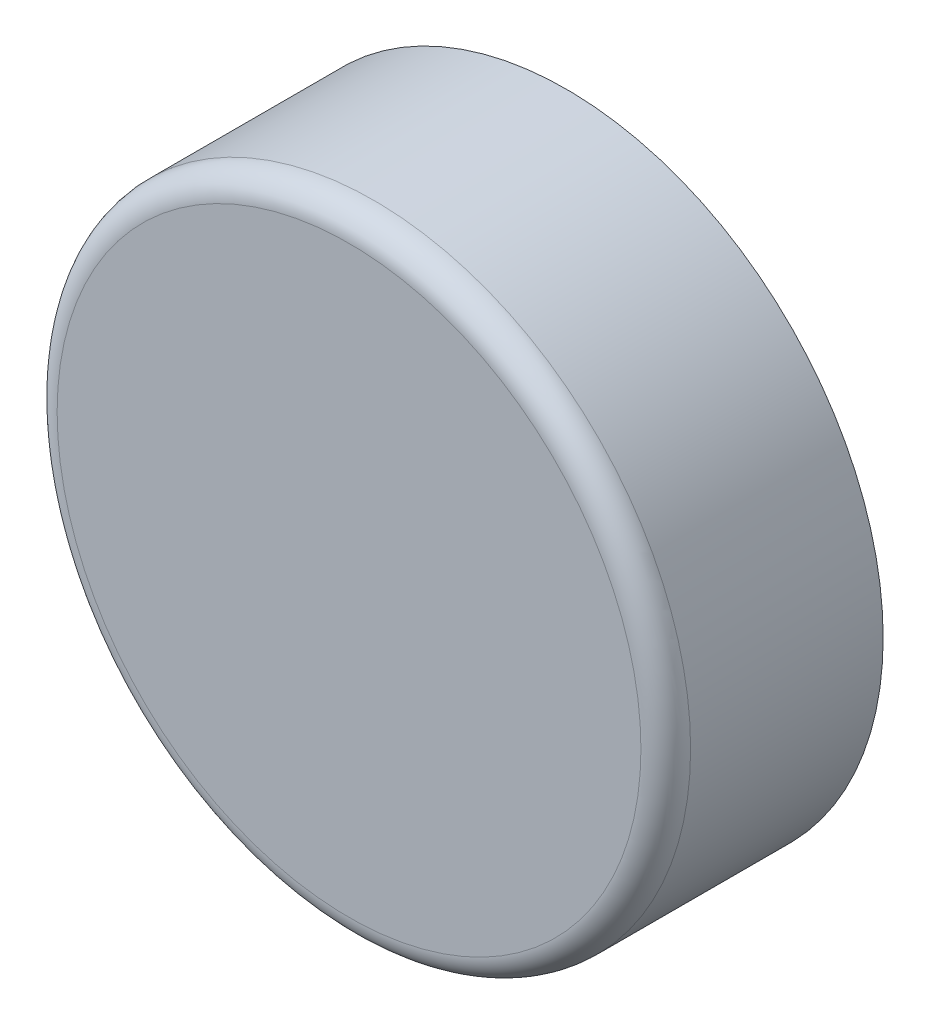
ISO-10303-21;
HEADER;
FILE_DESCRIPTION(('STEP AP214'),'2;1');
FILE_NAME('part.step','',(''),(''),'','','');
FILE_SCHEMA(('AUTOMOTIVE_DESIGN { 1 0 10303 214 1 1 1 1 }'));
ENDSEC;
DATA;
#1=APPLICATION_CONTEXT('core data for automotive mechanical design processes');
#2=APPLICATION_PROTOCOL_DEFINITION('international standard','automotive_design',2000,#1);
#3=PRODUCT_CONTEXT('',#1,'mechanical');
#4=PRODUCT('Part','Part','',(#3));
#5=PRODUCT_RELATED_PRODUCT_CATEGORY('part','',(#4));
#6=PRODUCT_DEFINITION_FORMATION('','',#4);
#7=PRODUCT_DEFINITION_CONTEXT('part definition',#1,'design');
#8=PRODUCT_DEFINITION('design','',#6,#7);
#9=PRODUCT_DEFINITION_SHAPE('','',#8);
#10=(LENGTH_UNIT() NAMED_UNIT(*) SI_UNIT(.MILLI.,.METRE.));
#11=(NAMED_UNIT(*) PLANE_ANGLE_UNIT() SI_UNIT($,.RADIAN.));
#12=(NAMED_UNIT(*) SI_UNIT($,.STERADIAN.) SOLID_ANGLE_UNIT());
#13=UNCERTAINTY_MEASURE_WITH_UNIT(LENGTH_MEASURE(1.E-05),#10,'distance_accuracy_value','');
#14=(GEOMETRIC_REPRESENTATION_CONTEXT(3) GLOBAL_UNCERTAINTY_ASSIGNED_CONTEXT((#13)) GLOBAL_UNIT_ASSIGNED_CONTEXT((#10,
#11,#12)) REPRESENTATION_CONTEXT('',''));
#15=CARTESIAN_POINT('',(0.,0.,0.));
#16=DIRECTION('',(0.,0.,1.));
#17=DIRECTION('',(1.,0.,0.));
#18=AXIS2_PLACEMENT_3D('',#15,#16,#17);
#19=CARTESIAN_POINT('',(3.81575680566778,1.5,0.));
#20=DIRECTION('',(0.,-1.,0.));
#21=DIRECTION('',(0.,0.,-1.));
#22=AXIS2_PLACEMENT_3D('',#19,#20,#21);
#23=PLANE('',#22);
#24=DIRECTION('',(0.,0.,1.));
#25=VECTOR('',#24,1.);
#26=CARTESIAN_POINT('',(3.81575680566778,1.5,0.));
#27=LINE('',#26,#25);
#28=CARTESIAN_POINT('',(3.81575680566778,1.5,1.9));
#29=VERTEX_POINT('',#28);
#30=CARTESIAN_POINT('',(3.81575680566778,1.5,1.4));
#31=VERTEX_POINT('',#30);
#32=EDGE_CURVE('E85',#29,#31,#27,.F.);
#33=ORIENTED_EDGE('',*,*,#32,.T.);
#34=CARTESIAN_POINT('',(3.81575680566778,1.5,1.9));
#35=CARTESIAN_POINT('',(3.80139060869233,1.49999999999999,1.88598631548121));
#36=CARTESIAN_POINT('',(3.78815737730604,1.49999999999999,1.87078972942495));
#37=CARTESIAN_POINT('',(3.76434453659747,1.50000000000001,1.83840897042549));
#38=CARTESIAN_POINT('',(3.75376911630161,1.50000000000002,1.82122172146764));
#39=CARTESIAN_POINT('',(3.73568778804339,1.49999999999998,1.78524575746864));
#40=CARTESIAN_POINT('',(3.72818850944359,1.49999999999995,1.76645368802888));
#41=CARTESIAN_POINT('',(3.71661565768007,1.50000000000005,1.72786088971128));
#42=CARTESIAN_POINT('',(3.71253826929904,1.5000000000002,1.70806131035512));
#43=CARTESIAN_POINT('',(3.70807498160108,1.49999999999981,1.66886995559483));
#44=CARTESIAN_POINT('',(3.7075452830286,1.4999999999993,1.64949449157155));
#45=CARTESIAN_POINT('',(3.709818627806,1.5000000000007,1.61094042047803));
#46=CARTESIAN_POINT('',(3.71262152761534,1.5000000000026,1.59176180496508));
#47=CARTESIAN_POINT('',(3.72135236020603,1.50000000000255,1.55453077860338));
#48=CARTESIAN_POINT('',(3.72721822090951,1.50000000000068,1.5364636914732));
#49=CARTESIAN_POINT('',(3.74181321265699,1.49999999999932,1.50152202996468));
#50=CARTESIAN_POINT('',(3.75054286869507,1.49999999999984,1.48464767492922));
#51=CARTESIAN_POINT('',(3.76832647638768,1.50000000000012,1.45607261561006));
#52=CARTESIAN_POINT('',(3.7768784205141,1.50000000000003,1.444054876011));
#53=CARTESIAN_POINT('',(3.79533960848316,1.49999999999997,1.42115303170038));
#54=CARTESIAN_POINT('',(3.80524590403796,1.50000000000001,1.41026655255157));
#55=CARTESIAN_POINT('',(3.81575680566762,1.5000000000004,1.40000000000009));
#56=B_SPLINE_CURVE_WITH_KNOTS('',3,(#34,#35,#36,#37,#38,#39,#40,#41,#42,#43,#44,#45,#46,#47,#48,
#49,#50,#51,#52,#53,#54,#55),.UNSPECIFIED.,.F.,.F.,(4,2,2,2,2,2,2,2,2,2,4),(0.,
0.0601668071968025,0.120427857975731,0.180818102947825,0.241140926364373,0.299003047591148,
0.356862676690833,0.41359282421872,0.470333377395996,0.514480479315194,0.558532963854867),.UNSPECIFIED.);
#57=EDGE_CURVE('E20',#29,#31,#56,.T.);
#58=ORIENTED_EDGE('',*,*,#57,.F.);
#59=EDGE_LOOP('',(#33,#58));
#60=FACE_BOUND('',#59,.T.);
#61=ADVANCED_FACE('F16',(#60),#23,.F.);
#62=CARTESIAN_POINT('',(-3.81575680566778,-1.5,0.));
#63=DIRECTION('',(0.,1.,0.));
#64=DIRECTION('',(0.,0.,1.));
#65=AXIS2_PLACEMENT_3D('',#62,#63,#64);
#66=PLANE('',#65);
#67=DIRECTION('',(0.,0.,1.));
#68=VECTOR('',#67,1.);
#69=CARTESIAN_POINT('',(3.81575680566778,-1.5,0.));
#70=LINE('',#69,#68);
#71=CARTESIAN_POINT('',(3.81575680566778,-1.5,1.4));
#72=VERTEX_POINT('',#71);
#73=CARTESIAN_POINT('',(3.81575680566778,-1.5,1.9));
#74=VERTEX_POINT('',#73);
#75=EDGE_CURVE('E101',#72,#74,#70,.T.);
#76=ORIENTED_EDGE('',*,*,#75,.T.);
#77=CARTESIAN_POINT('',(3.81575680566778,-1.5,1.4));
#78=CARTESIAN_POINT('',(3.80139060869233,-1.49999999999998,1.41401368451879));
#79=CARTESIAN_POINT('',(3.78815737730604,-1.49999999999999,1.42921027057505));
#80=CARTESIAN_POINT('',(3.76434453659747,-1.50000000000001,1.46159102957451));
#81=CARTESIAN_POINT('',(3.75376911630162,-1.50000000000002,1.47877827853236));
#82=CARTESIAN_POINT('',(3.73568778804339,-1.49999999999999,1.51475424253136));
#83=CARTESIAN_POINT('',(3.72818850944359,-1.49999999999995,1.53354631197112));
#84=CARTESIAN_POINT('',(3.71661565768007,-1.50000000000005,1.57213911028872));
#85=CARTESIAN_POINT('',(3.71253826929904,-1.5000000000002,1.59193868964488));
#86=CARTESIAN_POINT('',(3.70807498160108,-1.49999999999981,1.63113004440517));
#87=CARTESIAN_POINT('',(3.7075452830286,-1.4999999999993,1.65050550842845));
#88=CARTESIAN_POINT('',(3.709818627806,-1.5000000000007,1.68905957952197));
#89=CARTESIAN_POINT('',(3.71262152761534,-1.5000000000026,1.70823819503492));
#90=CARTESIAN_POINT('',(3.72135236020603,-1.50000000000255,1.74546922139662));
#91=CARTESIAN_POINT('',(3.72721822090951,-1.50000000000068,1.7635363085268));
#92=CARTESIAN_POINT('',(3.74181321265699,-1.49999999999932,1.79847797003532));
#93=CARTESIAN_POINT('',(3.75054286869507,-1.49999999999984,1.81535232507078));
#94=CARTESIAN_POINT('',(3.76832647638768,-1.50000000000012,1.84392738438994));
#95=CARTESIAN_POINT('',(3.7768784205141,-1.50000000000003,1.855945123989));
#96=CARTESIAN_POINT('',(3.79533960848316,-1.49999999999997,1.87884696829962));
#97=CARTESIAN_POINT('',(3.80524590403796,-1.50000000000001,1.88973344744843));
#98=CARTESIAN_POINT('',(3.81575680566762,-1.5000000000004,1.89999999999991));
#99=B_SPLINE_CURVE_WITH_KNOTS('',3,(#77,#78,#79,#80,#81,#82,#83,#84,#85,#86,#87,#88,#89,#90,#91,
#92,#93,#94,#95,#96,#97,#98),.UNSPECIFIED.,.F.,.F.,(4,2,2,2,2,2,2,2,2,2,4),(0.,
0.0601668071968026,0.120427857975731,0.180818102947826,0.241140926364374,0.299003047591149,
0.356862676690834,0.413592824218721,0.470333377395997,0.514480479315194,0.558532963854867),.UNSPECIFIED.);
#100=EDGE_CURVE('E98',#72,#74,#99,.T.);
#101=ORIENTED_EDGE('',*,*,#100,.F.);
#102=EDGE_LOOP('',(#76,#101));
#103=FACE_BOUND('',#102,.T.);
#104=ADVANCED_FACE('F203',(#103),#66,.F.);
#105=CARTESIAN_POINT('',(0.,0.,1.65));
#106=DIRECTION('',(0.,0.,1.));
#107=DIRECTION('',(1.,0.,0.));
#108=AXIS2_PLACEMENT_3D('',#105,#106,#107);
#109=TOROIDAL_SURFACE('',#108,4.3625,0.3625);
#110=ORIENTED_EDGE('',*,*,#100,.T.);
#111=CARTESIAN_POINT('',(0.,0.,1.9));
#112=DIRECTION('',(0.,0.,1.));
#113=DIRECTION('',(1.,0.,0.));
#114=AXIS2_PLACEMENT_3D('',#111,#112,#113);
#115=CIRCLE('',#114,4.1);
#116=EDGE_CURVE('E97',#74,#29,#115,.T.);
#117=ORIENTED_EDGE('',*,*,#116,.T.);
#118=ORIENTED_EDGE('',*,*,#57,.T.);
#119=CARTESIAN_POINT('',(0.,0.,1.4));
#120=DIRECTION('',(0.,0.,1.));
#121=DIRECTION('',(1.,0.,0.));
#122=AXIS2_PLACEMENT_3D('',#119,#120,#121);
#123=CIRCLE('',#122,4.1);
#124=EDGE_CURVE('E89',#31,#72,#123,.F.);
#125=ORIENTED_EDGE('',*,*,#124,.T.);
#126=EDGE_LOOP('',(#110,#117,#118,#125));
#127=FACE_BOUND('',#126,.T.);
#128=ADVANCED_FACE('F95',(#127),#109,.T.);
#129=CARTESIAN_POINT('',(-1.5,3.81575680566778,0.));
#130=DIRECTION('',(1.,0.,0.));
#131=DIRECTION('',(0.,0.,-1.));
#132=AXIS2_PLACEMENT_3D('',#129,#130,#131);
#133=PLANE('',#132);
#134=DIRECTION('',(0.,0.,1.));
#135=VECTOR('',#134,1.);
#136=CARTESIAN_POINT('',(-1.5,3.81575680566778,0.));
#137=LINE('',#136,#135);
#138=CARTESIAN_POINT('',(-1.5,3.81575680566778,1.9));
#139=VERTEX_POINT('',#138);
#140=CARTESIAN_POINT('',(-1.5,3.81575680566778,1.4));
#141=VERTEX_POINT('',#140);
#142=EDGE_CURVE('E208',#139,#141,#137,.F.);
#143=ORIENTED_EDGE('',*,*,#142,.T.);
#144=CARTESIAN_POINT('',(-1.5,3.81575680566778,1.9));
#145=CARTESIAN_POINT('',(-1.5,3.80140590950621,1.88600206855514));
#146=CARTESIAN_POINT('',(-1.5,3.78818558423929,1.87082252652514));
#147=CARTESIAN_POINT('',(-1.5,3.76436708899873,1.83844514674891));
#148=CARTESIAN_POINT('',(-1.5,3.75377879039019,1.82124005724234));
#149=CARTESIAN_POINT('',(-1.5,3.73567606801396,1.78522335309765));
#150=CARTESIAN_POINT('',(-1.5,3.72816898230207,1.76640803080771));
#151=CARTESIAN_POINT('',(-1.5,3.71660531464491,1.72780696119148));
#152=CARTESIAN_POINT('',(-1.5,3.71253613298425,1.7080250409854));
#153=CARTESIAN_POINT('',(-1.5,3.70882008656033,1.67542367251561));
#154=CARTESIAN_POINT('',(-1.5,3.70809791727015,1.66271545099623));
#155=CARTESIAN_POINT('',(-1.5,3.70810125528882,1.63071279165039));
#156=CARTESIAN_POINT('',(-1.5,3.70976787159709,1.61140894986068));
#157=CARTESIAN_POINT('',(-1.5,3.71637495460081,1.57333782942839));
#158=CARTESIAN_POINT('',(-1.5,3.7213224561901,1.55457179435302));
#159=CARTESIAN_POINT('',(-1.5,3.73426840399278,1.51819302003309));
#160=CARTESIAN_POINT('',(-1.5,3.74225758355076,1.50057696639676));
#161=CARTESIAN_POINT('',(-1.5,3.76100280283692,1.46685950968805));
#162=CARTESIAN_POINT('',(-1.5,3.7717612168063,1.4507594226089));
#163=CARTESIAN_POINT('',(-1.5,3.78866208835838,1.42933439831725));
#164=CARTESIAN_POINT('',(-1.5,3.79382491326603,1.42321399914667));
#165=CARTESIAN_POINT('',(-1.5,3.80451854439181,1.41133680067426));
#166=CARTESIAN_POINT('',(-1.5,3.81004819648805,1.40557896261553));
#167=CARTESIAN_POINT('',(-1.5,3.81575680566778,1.4));
#168=B_SPLINE_CURVE_WITH_KNOTS('',3,(#144,#145,#146,#147,#148,#149,#150,#151,#152,#153,#154,
#155,#156,#157,#158,#159,#160,#161,#162,#163,#164,#165,#166,#167),.UNSPECIFIED.,.F.,.F.,(4,2,2,
2,2,2,2,2,2,2,2,4),(0.,0.0601028610818858,0.120427846516437,0.180895676633031,0.241140922347588,
0.279259857336992,0.337079893875516,0.3950243110962,0.452793591741876,0.510612567613467,
0.534620727968011,0.558556640457983),.UNSPECIFIED.);
#169=EDGE_CURVE('E188',#139,#141,#168,.T.);
#170=ORIENTED_EDGE('',*,*,#169,.F.);
#171=EDGE_LOOP('',(#143,#170));
#172=FACE_BOUND('',#171,.T.);
#173=ADVANCED_FACE('F196',(#172),#133,.F.);
#174=CARTESIAN_POINT('',(0.,0.,1.65));
#175=DIRECTION('',(0.,0.,1.));
#176=DIRECTION('',(1.,0.,0.));
#177=AXIS2_PLACEMENT_3D('',#174,#175,#176);
#178=TOROIDAL_SURFACE('',#177,4.3625,0.3625);
#179=ORIENTED_EDGE('',*,*,#169,.T.);
#180=CARTESIAN_POINT('',(0.,0.,1.4));
#181=DIRECTION('',(0.,0.,1.));
#182=DIRECTION('',(1.,0.,0.));
#183=AXIS2_PLACEMENT_3D('',#180,#181,#182);
#184=CIRCLE('',#183,4.1);
#185=CARTESIAN_POINT('',(1.5,3.81575680566778,1.4));
#186=VERTEX_POINT('',#185);
#187=EDGE_CURVE('E215',#141,#186,#184,.F.);
#188=ORIENTED_EDGE('',*,*,#187,.T.);
#189=CARTESIAN_POINT('',(1.5,3.81575680566778,1.4));
#190=CARTESIAN_POINT('',(1.5,3.80140590950621,1.41399793144486));
#191=CARTESIAN_POINT('',(1.5,3.78818558423929,1.42917747347486));
#192=CARTESIAN_POINT('',(1.5,3.76436708899873,1.46155485325109));
#193=CARTESIAN_POINT('',(1.5,3.75377879039019,1.47875994275766));
#194=CARTESIAN_POINT('',(1.5,3.73567606801396,1.51477664690235));
#195=CARTESIAN_POINT('',(1.5,3.72816898230207,1.53359196919229));
#196=CARTESIAN_POINT('',(1.5,3.71660531464491,1.57219303880852));
#197=CARTESIAN_POINT('',(1.5,3.71253613298425,1.59197495901459));
#198=CARTESIAN_POINT('',(1.5,3.70882008656033,1.62457632748439));
#199=CARTESIAN_POINT('',(1.5,3.70809791727015,1.63728454900377));
#200=CARTESIAN_POINT('',(1.5,3.70810125528882,1.66928720834961));
#201=CARTESIAN_POINT('',(1.5,3.70976787159709,1.68859105013932));
#202=CARTESIAN_POINT('',(1.5,3.71637495460081,1.72666217057161));
#203=CARTESIAN_POINT('',(1.5,3.7213224561901,1.74542820564698));
#204=CARTESIAN_POINT('',(1.5,3.73426840399278,1.78180697996691));
#205=CARTESIAN_POINT('',(1.5,3.74225758355076,1.79942303360324));
#206=CARTESIAN_POINT('',(1.5,3.76100280283692,1.83314049031195));
#207=CARTESIAN_POINT('',(1.5,3.7717612168063,1.8492405773911));
#208=CARTESIAN_POINT('',(1.5,3.78866208835838,1.87066560168275));
#209=CARTESIAN_POINT('',(1.5,3.79382491326603,1.87678600085333));
#210=CARTESIAN_POINT('',(1.5,3.80451854439181,1.88866319932574));
#211=CARTESIAN_POINT('',(1.5,3.81004819648805,1.89442103738447));
#212=CARTESIAN_POINT('',(1.5,3.81575680566778,1.9));
#213=B_SPLINE_CURVE_WITH_KNOTS('',3,(#189,#190,#191,#192,#193,#194,#195,#196,#197,#198,#199,
#200,#201,#202,#203,#204,#205,#206,#207,#208,#209,#210,#211,#212),.UNSPECIFIED.,.F.,.F.,(4,2,2,
2,2,2,2,2,2,2,2,4),(0.,0.0601028610818861,0.120427846516436,0.180895676633031,0.241140922347587,
0.279259857336993,0.337079893875517,0.3950243110962,0.452793591741876,0.510612567613467,
0.534620727968012,0.558556640457984),.UNSPECIFIED.);
#214=CARTESIAN_POINT('',(1.5,3.81575680566778,1.9));
#215=VERTEX_POINT('',#214);
#216=EDGE_CURVE('E183',#186,#215,#213,.T.);
#217=ORIENTED_EDGE('',*,*,#216,.T.);
#218=CARTESIAN_POINT('',(0.,0.,1.9));
#219=DIRECTION('',(0.,0.,1.));
#220=DIRECTION('',(1.,0.,0.));
#221=AXIS2_PLACEMENT_3D('',#218,#219,#220);
#222=CIRCLE('',#221,4.1);
#223=EDGE_CURVE('E209',#215,#139,#222,.T.);
#224=ORIENTED_EDGE('',*,*,#223,.T.);
#225=EDGE_LOOP('',(#179,#188,#217,#224));
#226=FACE_BOUND('',#225,.T.);
#227=ADVANCED_FACE('F178',(#226),#178,.T.);
#228=CARTESIAN_POINT('',(1.5,3.70809924354783,0.));
#229=DIRECTION('',(-1.,0.,0.));
#230=DIRECTION('',(0.,0.,1.));
#231=AXIS2_PLACEMENT_3D('',#228,#229,#230);
#232=PLANE('',#231);
#233=ORIENTED_EDGE('',*,*,#216,.F.);
#234=DIRECTION('',(0.,0.,1.));
#235=VECTOR('',#234,1.);
#236=CARTESIAN_POINT('',(1.5,3.81575680566778,0.));
#237=LINE('',#236,#235);
#238=EDGE_CURVE('E217',#186,#215,#237,.T.);
#239=ORIENTED_EDGE('',*,*,#238,.T.);
#240=EDGE_LOOP('',(#233,#239));
#241=FACE_BOUND('',#240,.T.);
#242=ADVANCED_FACE('F173',(#241),#232,.F.);
#243=CARTESIAN_POINT('',(1.5,-3.81575680566778,0.));
#244=DIRECTION('',(-1.,0.,0.));
#245=DIRECTION('',(0.,0.,1.));
#246=AXIS2_PLACEMENT_3D('',#243,#244,#245);
#247=PLANE('',#246);
#248=DIRECTION('',(0.,0.,1.));
#249=VECTOR('',#248,1.);
#250=CARTESIAN_POINT('',(1.5,-3.81575680566778,0.));
#251=LINE('',#250,#249);
#252=CARTESIAN_POINT('',(1.5,-3.81575680566778,1.9));
#253=VERTEX_POINT('',#252);
#254=CARTESIAN_POINT('',(1.5,-3.81575680566778,1.4));
#255=VERTEX_POINT('',#254);
#256=EDGE_CURVE('E221',#253,#255,#251,.F.);
#257=ORIENTED_EDGE('',*,*,#256,.T.);
#258=CARTESIAN_POINT('',(1.5,-3.81575680566778,1.9));
#259=CARTESIAN_POINT('',(1.5,-3.80140590950621,1.88600206855514));
#260=CARTESIAN_POINT('',(1.5,-3.78818558423929,1.87082252652514));
#261=CARTESIAN_POINT('',(1.5,-3.76436708899873,1.83844514674891));
#262=CARTESIAN_POINT('',(1.5,-3.75377879039019,1.82124005724234));
#263=CARTESIAN_POINT('',(1.5,-3.73567606801396,1.78522335309765));
#264=CARTESIAN_POINT('',(1.5,-3.72816898230207,1.76640803080771));
#265=CARTESIAN_POINT('',(1.5,-3.7166053146449,1.72780696119148));
#266=CARTESIAN_POINT('',(1.5,-3.71253613298425,1.70802504098541));
#267=CARTESIAN_POINT('',(1.5,-3.70882008656033,1.67542367251561));
#268=CARTESIAN_POINT('',(1.5,-3.70809791727015,1.66271545099623));
#269=CARTESIAN_POINT('',(1.5,-3.70810125528882,1.63071279165039));
#270=CARTESIAN_POINT('',(1.5,-3.70976787159709,1.61140894986068));
#271=CARTESIAN_POINT('',(1.5,-3.71637495460081,1.57333782942839));
#272=CARTESIAN_POINT('',(1.5,-3.7213224561901,1.55457179435302));
#273=CARTESIAN_POINT('',(1.5,-3.73426840399278,1.51819302003309));
#274=CARTESIAN_POINT('',(1.5,-3.74225758355076,1.50057696639676));
#275=CARTESIAN_POINT('',(1.5,-3.76100280283692,1.46685950968805));
#276=CARTESIAN_POINT('',(1.5,-3.7717612168063,1.4507594226089));
#277=CARTESIAN_POINT('',(1.5,-3.78866208835838,1.42933439831725));
#278=CARTESIAN_POINT('',(1.5,-3.79382491326603,1.42321399914667));
#279=CARTESIAN_POINT('',(1.5,-3.80451854439181,1.41133680067426));
#280=CARTESIAN_POINT('',(1.5,-3.81004819648805,1.40557896261553));
#281=CARTESIAN_POINT('',(1.5,-3.81575680566778,1.4));
#282=B_SPLINE_CURVE_WITH_KNOTS('',3,(#258,#259,#260,#261,#262,#263,#264,#265,#266,#267,#268,
#269,#270,#271,#272,#273,#274,#275,#276,#277,#278,#279,#280,#281),.UNSPECIFIED.,.F.,.F.,(4,2,2,
2,2,2,2,2,2,2,2,4),(0.,0.0601028610818859,0.120427846516437,0.180895676633031,0.241140922347588,
0.279259857336993,0.337079893875517,0.395024311096201,0.452793591741877,0.510612567613468,
0.534620727968013,0.558556640457985),.UNSPECIFIED.);
#283=EDGE_CURVE('E165',#253,#255,#282,.T.);
#284=ORIENTED_EDGE('',*,*,#283,.F.);
#285=EDGE_LOOP('',(#257,#284));
#286=FACE_BOUND('',#285,.T.);
#287=ADVANCED_FACE('F169',(#286),#247,.F.);
#288=CARTESIAN_POINT('',(-1.5,-3.70809924354783,0.));
#289=DIRECTION('',(1.,0.,0.));
#290=DIRECTION('',(0.,0.,-1.));
#291=AXIS2_PLACEMENT_3D('',#288,#289,#290);
#292=PLANE('',#291);
#293=CARTESIAN_POINT('',(-1.5,-3.81575680566778,1.4));
#294=CARTESIAN_POINT('',(-1.5,-3.80140590950621,1.41399793144486));
#295=CARTESIAN_POINT('',(-1.5,-3.78818558423929,1.42917747347486));
#296=CARTESIAN_POINT('',(-1.5,-3.76436708899873,1.46155485325109));
#297=CARTESIAN_POINT('',(-1.5,-3.75377879039019,1.47875994275766));
#298=CARTESIAN_POINT('',(-1.5,-3.73567606801396,1.51477664690235));
#299=CARTESIAN_POINT('',(-1.5,-3.72816898230207,1.53359196919229));
#300=CARTESIAN_POINT('',(-1.5,-3.71660531464491,1.57219303880852));
#301=CARTESIAN_POINT('',(-1.5,-3.71253613298425,1.59197495901459));
#302=CARTESIAN_POINT('',(-1.5,-3.70882008656033,1.62457632748439));
#303=CARTESIAN_POINT('',(-1.5,-3.70809791727015,1.63728454900377));
#304=CARTESIAN_POINT('',(-1.5,-3.70810125528882,1.66928720834961));
#305=CARTESIAN_POINT('',(-1.5,-3.70976787159709,1.68859105013932));
#306=CARTESIAN_POINT('',(-1.5,-3.71637495460081,1.72666217057161));
#307=CARTESIAN_POINT('',(-1.5,-3.7213224561901,1.74542820564698));
#308=CARTESIAN_POINT('',(-1.5,-3.73426840399278,1.78180697996691));
#309=CARTESIAN_POINT('',(-1.5,-3.74225758355076,1.79942303360324));
#310=CARTESIAN_POINT('',(-1.5,-3.76100280283692,1.83314049031195));
#311=CARTESIAN_POINT('',(-1.5,-3.7717612168063,1.8492405773911));
#312=CARTESIAN_POINT('',(-1.5,-3.78866208835838,1.87066560168275));
#313=CARTESIAN_POINT('',(-1.5,-3.79382491326603,1.87678600085333));
#314=CARTESIAN_POINT('',(-1.5,-3.80451854439181,1.88866319932574));
#315=CARTESIAN_POINT('',(-1.5,-3.81004819648805,1.89442103738447));
#316=CARTESIAN_POINT('',(-1.5,-3.81575680566778,1.9));
#317=B_SPLINE_CURVE_WITH_KNOTS('',3,(#293,#294,#295,#296,#297,#298,#299,#300,#301,#302,#303,
#304,#305,#306,#307,#308,#309,#310,#311,#312,#313,#314,#315,#316),.UNSPECIFIED.,.F.,.F.,(4,2,2,
2,2,2,2,2,2,2,2,4),(0.,0.0601028610818859,0.120427846516436,0.180895676633031,0.241140922347587,
0.279259857336993,0.337079893875517,0.3950243110962,0.452793591741876,0.510612567613467,
0.534620727968012,0.558556640457984),.UNSPECIFIED.);
#318=CARTESIAN_POINT('',(-1.5,-3.81575680566778,1.4));
#319=VERTEX_POINT('',#318);
#320=CARTESIAN_POINT('',(-1.5,-3.81575680566778,1.9));
#321=VERTEX_POINT('',#320);
#322=EDGE_CURVE('E160',#319,#321,#317,.T.);
#323=ORIENTED_EDGE('',*,*,#322,.F.);
#324=DIRECTION('',(0.,0.,1.));
#325=VECTOR('',#324,1.);
#326=CARTESIAN_POINT('',(-1.5,-3.81575680566778,0.));
#327=LINE('',#326,#325);
#328=EDGE_CURVE('E148',#319,#321,#327,.T.);
#329=ORIENTED_EDGE('',*,*,#328,.T.);
#330=EDGE_LOOP('',(#323,#329));
#331=FACE_BOUND('',#330,.T.);
#332=ADVANCED_FACE('F154',(#331),#292,.F.);
#333=CARTESIAN_POINT('',(0.,0.,1.65));
#334=DIRECTION('',(0.,0.,1.));
#335=DIRECTION('',(1.,0.,0.));
#336=AXIS2_PLACEMENT_3D('',#333,#334,#335);
#337=TOROIDAL_SURFACE('',#336,4.3625,0.3625);
#338=CARTESIAN_POINT('',(0.,0.,1.9));
#339=DIRECTION('',(0.,0.,1.));
#340=DIRECTION('',(1.,0.,0.));
#341=AXIS2_PLACEMENT_3D('',#338,#339,#340);
#342=CIRCLE('',#341,4.1);
#343=EDGE_CURVE('E228',#321,#253,#342,.T.);
#344=ORIENTED_EDGE('',*,*,#343,.T.);
#345=ORIENTED_EDGE('',*,*,#283,.T.);
#346=CARTESIAN_POINT('',(0.,0.,1.4));
#347=DIRECTION('',(0.,0.,1.));
#348=DIRECTION('',(1.,0.,0.));
#349=AXIS2_PLACEMENT_3D('',#346,#347,#348);
#350=CIRCLE('',#349,4.1);
#351=EDGE_CURVE('E224',#255,#319,#350,.F.);
#352=ORIENTED_EDGE('',*,*,#351,.T.);
#353=ORIENTED_EDGE('',*,*,#322,.T.);
#354=EDGE_LOOP('',(#344,#345,#352,#353));
#355=FACE_BOUND('',#354,.T.);
#356=ADVANCED_FACE('F150',(#355),#337,.T.);
#357=CARTESIAN_POINT('',(-3.81575680566778,-1.5,0.));
#358=DIRECTION('',(0.,1.,0.));
#359=DIRECTION('',(0.,0.,1.));
#360=AXIS2_PLACEMENT_3D('',#357,#358,#359);
#361=PLANE('',#360);
#362=DIRECTION('',(0.,0.,1.));
#363=VECTOR('',#362,1.);
#364=CARTESIAN_POINT('',(-3.81575680566778,-1.5,0.));
#365=LINE('',#364,#363);
#366=CARTESIAN_POINT('',(-3.81575680566778,-1.5,1.9));
#367=VERTEX_POINT('',#366);
#368=CARTESIAN_POINT('',(-3.81575680566778,-1.5,1.4));
#369=VERTEX_POINT('',#368);
#370=EDGE_CURVE('E144',#367,#369,#365,.F.);
#371=ORIENTED_EDGE('',*,*,#370,.T.);
#372=CARTESIAN_POINT('',(-3.81575680566778,-1.5,1.9));
#373=CARTESIAN_POINT('',(-3.80139060869233,-1.49999999999999,1.88598631548121));
#374=CARTESIAN_POINT('',(-3.78815737730604,-1.49999999999999,1.87078972942495));
#375=CARTESIAN_POINT('',(-3.76434453659747,-1.50000000000001,1.83840897042549));
#376=CARTESIAN_POINT('',(-3.75376911630162,-1.50000000000001,1.82122172146764));
#377=CARTESIAN_POINT('',(-3.73568778804339,-1.49999999999998,1.78524575746864));
#378=CARTESIAN_POINT('',(-3.72818850944359,-1.49999999999995,1.76645368802888));
#379=CARTESIAN_POINT('',(-3.71661565768007,-1.50000000000005,1.72786088971128));
#380=CARTESIAN_POINT('',(-3.71253826929904,-1.5000000000002,1.70806131035512));
#381=CARTESIAN_POINT('',(-3.70807498160108,-1.49999999999981,1.66886995559483));
#382=CARTESIAN_POINT('',(-3.7075452830286,-1.4999999999993,1.64949449157155));
#383=CARTESIAN_POINT('',(-3.709818627806,-1.5000000000007,1.61094042047803));
#384=CARTESIAN_POINT('',(-3.71262152761534,-1.5000000000026,1.59176180496508));
#385=CARTESIAN_POINT('',(-3.72135236020603,-1.50000000000255,1.55453077860338));
#386=CARTESIAN_POINT('',(-3.72721822090951,-1.50000000000068,1.5364636914732));
#387=CARTESIAN_POINT('',(-3.74181321265699,-1.49999999999932,1.50152202996468));
#388=CARTESIAN_POINT('',(-3.75054286869507,-1.49999999999984,1.48464767492922));
#389=CARTESIAN_POINT('',(-3.76832647638768,-1.50000000000012,1.45607261561006));
#390=CARTESIAN_POINT('',(-3.7768784205141,-1.50000000000003,1.444054876011));
#391=CARTESIAN_POINT('',(-3.79533960848316,-1.49999999999997,1.42115303170038));
#392=CARTESIAN_POINT('',(-3.80524590403796,-1.50000000000001,1.41026655255157));
#393=CARTESIAN_POINT('',(-3.81575680566762,-1.5000000000004,1.40000000000009));
#394=B_SPLINE_CURVE_WITH_KNOTS('',3,(#372,#373,#374,#375,#376,#377,#378,#379,#380,#381,#382,
#383,#384,#385,#386,#387,#388,#389,#390,#391,#392,#393),.UNSPECIFIED.,.F.,.F.,(4,2,2,2,2,2,2,2,
2,2,4),(0.,0.0601668071968029,0.120427857975732,0.180818102947827,0.241140926364375,
0.29900304759115,0.356862676690835,0.413592824218722,0.470333377395999,0.514480479315196,
0.558532963854868),.UNSPECIFIED.);
#395=EDGE_CURVE('E122',#367,#369,#394,.T.);
#396=ORIENTED_EDGE('',*,*,#395,.F.);
#397=EDGE_LOOP('',(#371,#396));
#398=FACE_BOUND('',#397,.T.);
#399=ADVANCED_FACE('F135',(#398),#361,.F.);
#400=CARTESIAN_POINT('',(0.,0.,1.65));
#401=DIRECTION('',(0.,0.,1.));
#402=DIRECTION('',(1.,0.,0.));
#403=AXIS2_PLACEMENT_3D('',#400,#401,#402);
#404=TOROIDAL_SURFACE('',#403,4.3625,0.3625);
#405=ORIENTED_EDGE('',*,*,#395,.T.);
#406=CARTESIAN_POINT('',(0.,0.,1.4));
#407=DIRECTION('',(0.,0.,1.));
#408=DIRECTION('',(1.,0.,0.));
#409=AXIS2_PLACEMENT_3D('',#406,#407,#408);
#410=CIRCLE('',#409,4.1);
#411=CARTESIAN_POINT('',(-3.81575680566778,1.5,1.4));
#412=VERTEX_POINT('',#411);
#413=EDGE_CURVE('E39',#369,#412,#410,.F.);
#414=ORIENTED_EDGE('',*,*,#413,.T.);
#415=CARTESIAN_POINT('',(-3.81575680566778,1.5,1.4));
#416=CARTESIAN_POINT('',(-3.80139060869233,1.49999999999998,1.41401368451879));
#417=CARTESIAN_POINT('',(-3.78815737730604,1.49999999999999,1.42921027057505));
#418=CARTESIAN_POINT('',(-3.76434453659747,1.50000000000001,1.46159102957451));
#419=CARTESIAN_POINT('',(-3.75376911630162,1.50000000000002,1.47877827853236));
#420=CARTESIAN_POINT('',(-3.73568778804339,1.49999999999999,1.51475424253136));
#421=CARTESIAN_POINT('',(-3.72818850944359,1.49999999999995,1.53354631197112));
#422=CARTESIAN_POINT('',(-3.71661565768007,1.50000000000005,1.57213911028872));
#423=CARTESIAN_POINT('',(-3.71253826929904,1.5000000000002,1.59193868964488));
#424=CARTESIAN_POINT('',(-3.70807498160108,1.49999999999981,1.63113004440517));
#425=CARTESIAN_POINT('',(-3.7075452830286,1.4999999999993,1.65050550842845));
#426=CARTESIAN_POINT('',(-3.709818627806,1.5000000000007,1.68905957952197));
#427=CARTESIAN_POINT('',(-3.71262152761534,1.5000000000026,1.70823819503492));
#428=CARTESIAN_POINT('',(-3.72135236020603,1.50000000000255,1.74546922139662));
#429=CARTESIAN_POINT('',(-3.72721822090951,1.50000000000068,1.7635363085268));
#430=CARTESIAN_POINT('',(-3.74181321265699,1.49999999999932,1.79847797003532));
#431=CARTESIAN_POINT('',(-3.75054286869507,1.49999999999984,1.81535232507078));
#432=CARTESIAN_POINT('',(-3.76832647638768,1.50000000000012,1.84392738438994));
#433=CARTESIAN_POINT('',(-3.7768784205141,1.50000000000003,1.855945123989));
#434=CARTESIAN_POINT('',(-3.79533960848316,1.49999999999997,1.87884696829962));
#435=CARTESIAN_POINT('',(-3.80524590403796,1.50000000000001,1.88973344744843));
#436=CARTESIAN_POINT('',(-3.81575680566762,1.5000000000004,1.89999999999992));
#437=B_SPLINE_CURVE_WITH_KNOTS('',3,(#415,#416,#417,#418,#419,#420,#421,#422,#423,#424,#425,
#426,#427,#428,#429,#430,#431,#432,#433,#434,#435,#436),.UNSPECIFIED.,.F.,.F.,(4,2,2,2,2,2,2,2,
2,2,4),(0.,0.0601668071968025,0.120427857975732,0.180818102947826,0.241140926364374,
0.299003047591149,0.356862676690835,0.413592824218722,0.470333377395998,0.514480479315195,
0.558532963854868),.UNSPECIFIED.);
#438=CARTESIAN_POINT('',(-3.8157568056677,1.5000000000002,1.89999999999996));
#439=VERTEX_POINT('',#438);
#440=EDGE_CURVE('E90',#412,#439,#437,.T.);
#441=ORIENTED_EDGE('',*,*,#440,.T.);
#442=CARTESIAN_POINT('',(0.,0.,1.9));
#443=DIRECTION('',(0.,0.,1.));
#444=DIRECTION('',(1.,0.,0.));
#445=AXIS2_PLACEMENT_3D('',#442,#443,#444);
#446=CIRCLE('',#445,4.1);
#447=EDGE_CURVE('E142',#439,#367,#446,.T.);
#448=ORIENTED_EDGE('',*,*,#447,.T.);
#449=EDGE_LOOP('',(#405,#414,#441,#448));
#450=FACE_BOUND('',#449,.T.);
#451=ADVANCED_FACE('F131',(#450),#404,.T.);
#452=CARTESIAN_POINT('',(3.81575680566778,1.5,0.));
#453=DIRECTION('',(0.,-1.,0.));
#454=DIRECTION('',(0.,0.,-1.));
#455=AXIS2_PLACEMENT_3D('',#452,#453,#454);
#456=PLANE('',#455);
#457=DIRECTION('',(0.,0.,1.));
#458=VECTOR('',#457,1.);
#459=CARTESIAN_POINT('',(-3.81575680566778,1.5,0.));
#460=LINE('',#459,#458);
#461=EDGE_CURVE('E115',#412,#439,#460,.T.);
#462=ORIENTED_EDGE('',*,*,#461,.T.);
#463=ORIENTED_EDGE('',*,*,#440,.F.);
#464=EDGE_LOOP('',(#462,#463));
#465=FACE_BOUND('',#464,.T.);
#466=ADVANCED_FACE('F128',(#465),#456,.F.);
#467=CARTESIAN_POINT('',(0.,0.,2.5));
#468=DIRECTION('',(0.,0.,-1.));
#469=DIRECTION('',(-1.,0.,0.));
#470=AXIS2_PLACEMENT_3D('',#467,#468,#469);
#471=PLANE('',#470);
#472=CARTESIAN_POINT('',(0.,0.,2.5));
#473=DIRECTION('',(0.,0.,1.));
#474=DIRECTION('',(1.,0.,0.));
#475=AXIS2_PLACEMENT_3D('',#472,#473,#474);
#476=CIRCLE('',#475,4.1);
#477=CARTESIAN_POINT('',(4.1,0.,2.5));
#478=VERTEX_POINT('',#477);
#479=EDGE_CURVE('E112',#478,#478,#476,.F.);
#480=ORIENTED_EDGE('',*,*,#479,.T.);
#481=EDGE_LOOP('',(#480));
#482=FACE_BOUND('',#481,.T.);
#483=ADVANCED_FACE('F241',(#482),#471,.T.);
#484=CARTESIAN_POINT('',(0.,0.,0.));
#485=DIRECTION('',(0.,0.,1.));
#486=DIRECTION('',(1.,0.,0.));
#487=AXIS2_PLACEMENT_3D('',#484,#485,#486);
#488=CYLINDRICAL_SURFACE('',#487,4.1);
#489=ORIENTED_EDGE('',*,*,#479,.F.);
#490=EDGE_LOOP('',(#489));
#491=FACE_BOUND('',#490,.T.);
#492=ORIENTED_EDGE('',*,*,#413,.F.);
#493=ORIENTED_EDGE('',*,*,#370,.F.);
#494=ORIENTED_EDGE('',*,*,#447,.F.);
#495=ORIENTED_EDGE('',*,*,#461,.F.);
#496=EDGE_LOOP('',(#492,#493,#494,#495));
#497=FACE_BOUND('',#496,.T.);
#498=ORIENTED_EDGE('',*,*,#328,.F.);
#499=ORIENTED_EDGE('',*,*,#351,.F.);
#500=ORIENTED_EDGE('',*,*,#256,.F.);
#501=ORIENTED_EDGE('',*,*,#343,.F.);
#502=EDGE_LOOP('',(#498,#499,#500,#501));
#503=FACE_BOUND('',#502,.T.);
#504=ORIENTED_EDGE('',*,*,#187,.F.);
#505=ORIENTED_EDGE('',*,*,#142,.F.);
#506=ORIENTED_EDGE('',*,*,#223,.F.);
#507=ORIENTED_EDGE('',*,*,#238,.F.);
#508=EDGE_LOOP('',(#504,#505,#506,#507));
#509=FACE_BOUND('',#508,.T.);
#510=ORIENTED_EDGE('',*,*,#75,.F.);
#511=ORIENTED_EDGE('',*,*,#124,.F.);
#512=ORIENTED_EDGE('',*,*,#32,.F.);
#513=ORIENTED_EDGE('',*,*,#116,.F.);
#514=EDGE_LOOP('',(#510,#511,#512,#513));
#515=FACE_BOUND('',#514,.T.);
#516=CARTESIAN_POINT('',(0.,0.,0.));
#517=DIRECTION('',(0.,0.,1.));
#518=DIRECTION('',(1.,0.,0.));
#519=AXIS2_PLACEMENT_3D('',#516,#517,#518);
#520=CIRCLE('',#519,4.1);
#521=CARTESIAN_POINT('',(4.1,0.,0.));
#522=VERTEX_POINT('',#521);
#523=EDGE_CURVE('E109',#522,#522,#520,.T.);
#524=ORIENTED_EDGE('',*,*,#523,.F.);
#525=EDGE_LOOP('',(#524));
#526=FACE_BOUND('',#525,.T.);
#527=ADVANCED_FACE('F99',(#491,#497,#503,#509,#515,#526),#488,.F.);
#528=CARTESIAN_POINT('',(0.,0.,3.5));
#529=DIRECTION('',(0.,0.,-1.));
#530=DIRECTION('',(-1.,0.,0.));
#531=AXIS2_PLACEMENT_3D('',#528,#529,#530);
#532=PLANE('',#531);
#533=CARTESIAN_POINT('',(0.,0.,3.5));
#534=DIRECTION('',(0.,0.,-1.));
#535=DIRECTION('',(1.,0.,0.));
#536=AXIS2_PLACEMENT_3D('',#533,#534,#535);
#537=CIRCLE('',#536,4.7);
#538=CARTESIAN_POINT('',(4.7,0.,3.5));
#539=VERTEX_POINT('',#538);
#540=EDGE_CURVE('E108',#539,#539,#537,.T.);
#541=ORIENTED_EDGE('',*,*,#540,.F.);
#542=EDGE_LOOP('',(#541));
#543=FACE_BOUND('',#542,.T.);
#544=ADVANCED_FACE('F240',(#543),#532,.F.);
#545=CARTESIAN_POINT('',(0.,0.,0.));
#546=DIRECTION('',(0.,0.,-1.));
#547=DIRECTION('',(-1.,0.,0.));
#548=AXIS2_PLACEMENT_3D('',#545,#546,#547);
#549=PLANE('',#548);
#550=ORIENTED_EDGE('',*,*,#523,.T.);
#551=EDGE_LOOP('',(#550));
#552=FACE_BOUND('',#551,.T.);
#553=CARTESIAN_POINT('',(0.,0.,0.));
#554=DIRECTION('',(0.,0.,1.));
#555=DIRECTION('',(1.,0.,0.));
#556=AXIS2_PLACEMENT_3D('',#553,#554,#555);
#557=CIRCLE('',#556,5.1);
#558=CARTESIAN_POINT('',(5.1,0.,0.));
#559=VERTEX_POINT('',#558);
#560=EDGE_CURVE('E30',#559,#559,#557,.T.);
#561=ORIENTED_EDGE('',*,*,#560,.F.);
#562=EDGE_LOOP('',(#561));
#563=FACE_BOUND('',#562,.T.);
#564=ADVANCED_FACE('F258',(#552,#563),#549,.T.);
#565=CARTESIAN_POINT('',(0.,0.,3.1));
#566=DIRECTION('',(0.,0.,-1.));
#567=DIRECTION('',(-1.,0.,0.));
#568=AXIS2_PLACEMENT_3D('',#565,#566,#567);
#569=TOROIDAL_SURFACE('',#568,4.7,0.4);
#570=CARTESIAN_POINT('',(0.,0.,3.1));
#571=DIRECTION('',(0.,0.,1.));
#572=DIRECTION('',(1.,0.,0.));
#573=AXIS2_PLACEMENT_3D('',#570,#571,#572);
#574=CIRCLE('',#573,5.1);
#575=CARTESIAN_POINT('',(5.1,0.,3.1));
#576=VERTEX_POINT('',#575);
#577=EDGE_CURVE('E10',#576,#576,#574,.F.);
#578=ORIENTED_EDGE('',*,*,#577,.F.);
#579=EDGE_LOOP('',(#578));
#580=FACE_BOUND('',#579,.T.);
#581=ORIENTED_EDGE('',*,*,#540,.T.);
#582=EDGE_LOOP('',(#581));
#583=FACE_BOUND('',#582,.T.);
#584=ADVANCED_FACE('F252',(#580,#583),#569,.T.);
#585=CARTESIAN_POINT('',(0.,0.,0.));
#586=DIRECTION('',(0.,0.,1.));
#587=DIRECTION('',(1.,0.,0.));
#588=AXIS2_PLACEMENT_3D('',#585,#586,#587);
#589=CYLINDRICAL_SURFACE('',#588,5.1);
#590=ORIENTED_EDGE('',*,*,#577,.T.);
#591=EDGE_LOOP('',(#590));
#592=FACE_BOUND('',#591,.T.);
#593=ORIENTED_EDGE('',*,*,#560,.T.);
#594=EDGE_LOOP('',(#593));
#595=FACE_BOUND('',#594,.T.);
#596=ADVANCED_FACE('F250',(#592,#595),#589,.T.);
#597=CLOSED_SHELL('',(#61,#104,#128,#173,#227,#242,#287,#332,#356,#399,#451,#466,#483,#527,#544,
#564,#584,#596));
#598=MANIFOLD_SOLID_BREP('B1',#597);
#599=ADVANCED_BREP_SHAPE_REPRESENTATION('',(#18,#598),#14);
#600=SHAPE_DEFINITION_REPRESENTATION(#9,#599);
ENDSEC;
END-ISO-10303-21;
